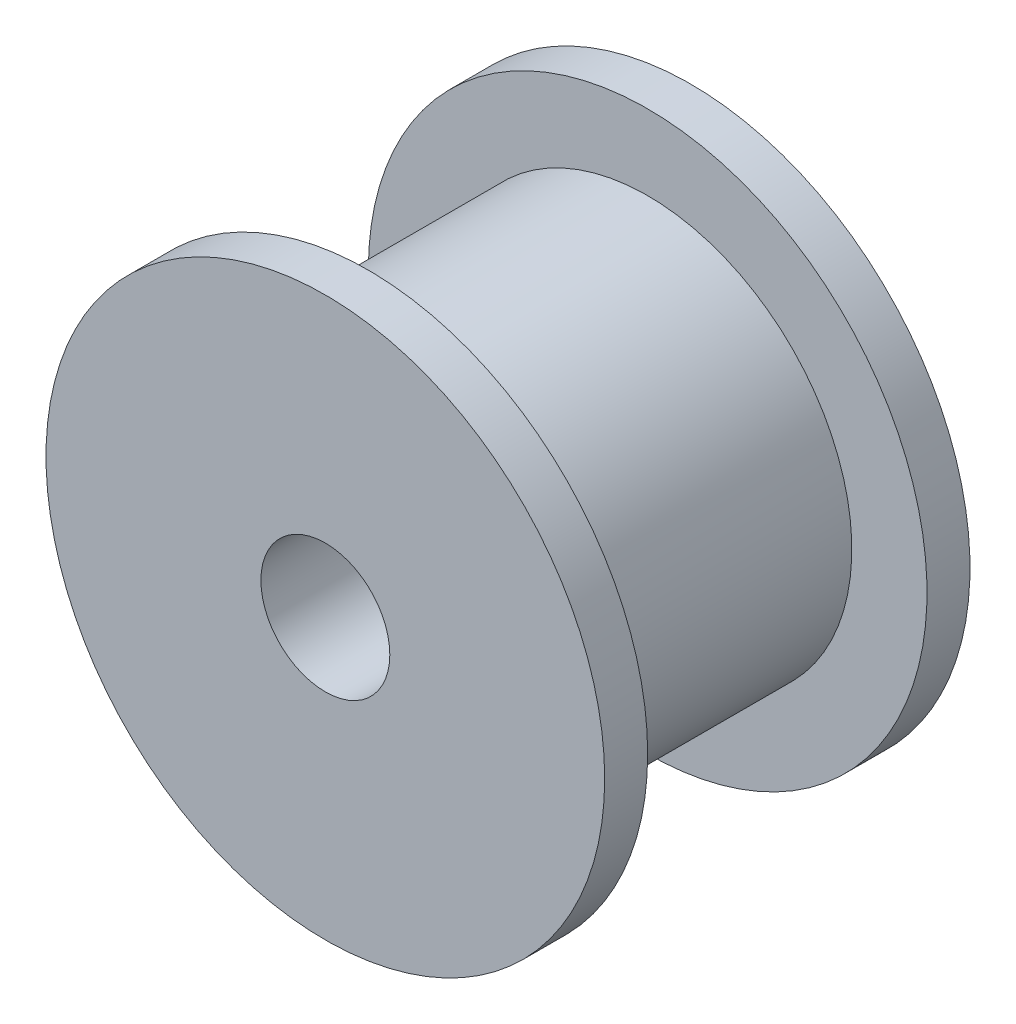
ISO-10303-21;
HEADER;
FILE_DESCRIPTION(('STEP AP214'),'2;1');
FILE_NAME('part.step','',(''),(''),'','','');
FILE_SCHEMA(('AUTOMOTIVE_DESIGN { 1 0 10303 214 1 1 1 1 }'));
ENDSEC;
DATA;
#1=APPLICATION_CONTEXT('core data for automotive mechanical design processes');
#2=APPLICATION_PROTOCOL_DEFINITION('international standard','automotive_design',2000,#1);
#3=PRODUCT_CONTEXT('',#1,'mechanical');
#4=PRODUCT('Part','Part','',(#3));
#5=PRODUCT_RELATED_PRODUCT_CATEGORY('part','',(#4));
#6=PRODUCT_DEFINITION_FORMATION('','',#4);
#7=PRODUCT_DEFINITION_CONTEXT('part definition',#1,'design');
#8=PRODUCT_DEFINITION('design','',#6,#7);
#9=PRODUCT_DEFINITION_SHAPE('','',#8);
#10=(LENGTH_UNIT() NAMED_UNIT(*) SI_UNIT(.MILLI.,.METRE.));
#11=(NAMED_UNIT(*) PLANE_ANGLE_UNIT() SI_UNIT($,.RADIAN.));
#12=(NAMED_UNIT(*) SI_UNIT($,.STERADIAN.) SOLID_ANGLE_UNIT());
#13=UNCERTAINTY_MEASURE_WITH_UNIT(LENGTH_MEASURE(1.E-05),#10,'distance_accuracy_value','');
#14=(GEOMETRIC_REPRESENTATION_CONTEXT(3) GLOBAL_UNCERTAINTY_ASSIGNED_CONTEXT((#13)) GLOBAL_UNIT_ASSIGNED_CONTEXT((#10,
#11,#12)) REPRESENTATION_CONTEXT('',''));
#15=CARTESIAN_POINT('',(0.,0.,0.));
#16=DIRECTION('',(0.,0.,1.));
#17=DIRECTION('',(1.,0.,0.));
#18=AXIS2_PLACEMENT_3D('',#15,#16,#17);
#19=CARTESIAN_POINT('',(0.,0.,8.5));
#20=DIRECTION('',(0.,0.,-1.));
#21=DIRECTION('',(-1.,0.,0.));
#22=AXIS2_PLACEMENT_3D('',#19,#20,#21);
#23=CYLINDRICAL_SURFACE('',#22,4.75);
#24=CARTESIAN_POINT('',(0.,0.,7.5));
#25=DIRECTION('',(0.,0.,1.));
#26=DIRECTION('',(1.,0.,0.));
#27=AXIS2_PLACEMENT_3D('',#24,#25,#26);
#28=CIRCLE('',#27,4.75);
#29=CARTESIAN_POINT('',(4.75,0.,7.5));
#30=VERTEX_POINT('',#29);
#31=EDGE_CURVE('E44',#30,#30,#28,.T.);
#32=ORIENTED_EDGE('',*,*,#31,.F.);
#33=EDGE_LOOP('',(#32));
#34=FACE_BOUND('',#33,.T.);
#35=CARTESIAN_POINT('',(0.,0.,1.));
#36=DIRECTION('',(0.,0.,-1.));
#37=DIRECTION('',(-1.,0.,0.));
#38=AXIS2_PLACEMENT_3D('',#35,#36,#37);
#39=CIRCLE('',#38,4.75);
#40=CARTESIAN_POINT('',(-4.75,0.,1.));
#41=VERTEX_POINT('',#40);
#42=EDGE_CURVE('E10',#41,#41,#39,.T.);
#43=ORIENTED_EDGE('',*,*,#42,.F.);
#44=EDGE_LOOP('',(#43));
#45=FACE_BOUND('',#44,.T.);
#46=ADVANCED_FACE('F37',(#34,#45),#23,.T.);
#47=CARTESIAN_POINT('',(0.,0.,7.5));
#48=DIRECTION('',(0.,0.,1.));
#49=DIRECTION('',(1.,0.,0.));
#50=AXIS2_PLACEMENT_3D('',#47,#48,#49);
#51=CYLINDRICAL_SURFACE('',#50,6.5);
#52=CARTESIAN_POINT('',(0.,0.,7.5));
#53=DIRECTION('',(0.,0.,1.));
#54=DIRECTION('',(1.,0.,0.));
#55=AXIS2_PLACEMENT_3D('',#52,#53,#54);
#56=CIRCLE('',#55,6.5);
#57=CARTESIAN_POINT('',(6.5,0.,7.5));
#58=VERTEX_POINT('',#57);
#59=EDGE_CURVE('E49',#58,#58,#56,.T.);
#60=ORIENTED_EDGE('',*,*,#59,.T.);
#61=EDGE_LOOP('',(#60));
#62=FACE_BOUND('',#61,.T.);
#63=CARTESIAN_POINT('',(0.,0.,8.5));
#64=DIRECTION('',(0.,0.,1.));
#65=DIRECTION('',(1.,0.,0.));
#66=AXIS2_PLACEMENT_3D('',#63,#64,#65);
#67=CIRCLE('',#66,6.5);
#68=CARTESIAN_POINT('',(6.5,0.,8.5));
#69=VERTEX_POINT('',#68);
#70=EDGE_CURVE('E54',#69,#69,#67,.T.);
#71=ORIENTED_EDGE('',*,*,#70,.F.);
#72=EDGE_LOOP('',(#71));
#73=FACE_BOUND('',#72,.T.);
#74=ADVANCED_FACE('F100',(#62,#73),#51,.T.);
#75=CARTESIAN_POINT('',(0.,0.,7.5));
#76=DIRECTION('',(0.,0.,1.));
#77=DIRECTION('',(1.,0.,0.));
#78=AXIS2_PLACEMENT_3D('',#75,#76,#77);
#79=PLANE('',#78);
#80=ORIENTED_EDGE('',*,*,#31,.T.);
#81=EDGE_LOOP('',(#80));
#82=FACE_BOUND('',#81,.T.);
#83=ORIENTED_EDGE('',*,*,#59,.F.);
#84=EDGE_LOOP('',(#83));
#85=FACE_BOUND('',#84,.T.);
#86=ADVANCED_FACE('F95',(#82,#85),#79,.F.);
#87=CARTESIAN_POINT('',(0.,0.,8.5));
#88=DIRECTION('',(0.,0.,1.));
#89=DIRECTION('',(1.,0.,0.));
#90=AXIS2_PLACEMENT_3D('',#87,#88,#89);
#91=PLANE('',#90);
#92=CARTESIAN_POINT('',(0.,0.,8.5));
#93=DIRECTION('',(0.,0.,1.));
#94=DIRECTION('',(1.,0.,0.));
#95=AXIS2_PLACEMENT_3D('',#92,#93,#94);
#96=CIRCLE('',#95,1.5);
#97=CARTESIAN_POINT('',(1.5,0.,8.5));
#98=VERTEX_POINT('',#97);
#99=EDGE_CURVE('E65',#98,#98,#96,.T.);
#100=ORIENTED_EDGE('',*,*,#99,.F.);
#101=EDGE_LOOP('',(#100));
#102=FACE_BOUND('',#101,.T.);
#103=ORIENTED_EDGE('',*,*,#70,.T.);
#104=EDGE_LOOP('',(#103));
#105=FACE_BOUND('',#104,.T.);
#106=ADVANCED_FACE('F87',(#102,#105),#91,.T.);
#107=CARTESIAN_POINT('',(0.,0.,1.));
#108=DIRECTION('',(0.,0.,-1.));
#109=DIRECTION('',(-1.,0.,0.));
#110=AXIS2_PLACEMENT_3D('',#107,#108,#109);
#111=CYLINDRICAL_SURFACE('',#110,6.5);
#112=CARTESIAN_POINT('',(0.,0.,1.));
#113=DIRECTION('',(0.,0.,-1.));
#114=DIRECTION('',(-1.,0.,0.));
#115=AXIS2_PLACEMENT_3D('',#112,#113,#114);
#116=CIRCLE('',#115,6.5);
#117=CARTESIAN_POINT('',(-6.5,0.,1.));
#118=VERTEX_POINT('',#117);
#119=EDGE_CURVE('E59',#118,#118,#116,.T.);
#120=ORIENTED_EDGE('',*,*,#119,.T.);
#121=EDGE_LOOP('',(#120));
#122=FACE_BOUND('',#121,.T.);
#123=CARTESIAN_POINT('',(0.,0.,0.));
#124=DIRECTION('',(0.,0.,-1.));
#125=DIRECTION('',(-1.,0.,0.));
#126=AXIS2_PLACEMENT_3D('',#123,#124,#125);
#127=CIRCLE('',#126,6.5);
#128=CARTESIAN_POINT('',(-6.5,0.,0.));
#129=VERTEX_POINT('',#128);
#130=EDGE_CURVE('E61',#129,#129,#127,.T.);
#131=ORIENTED_EDGE('',*,*,#130,.F.);
#132=EDGE_LOOP('',(#131));
#133=FACE_BOUND('',#132,.T.);
#134=ADVANCED_FACE('F85',(#122,#133),#111,.T.);
#135=CARTESIAN_POINT('',(0.,0.,1.));
#136=DIRECTION('',(0.,0.,-1.));
#137=DIRECTION('',(-1.,0.,0.));
#138=AXIS2_PLACEMENT_3D('',#135,#136,#137);
#139=PLANE('',#138);
#140=ORIENTED_EDGE('',*,*,#42,.T.);
#141=EDGE_LOOP('',(#140));
#142=FACE_BOUND('',#141,.T.);
#143=ORIENTED_EDGE('',*,*,#119,.F.);
#144=EDGE_LOOP('',(#143));
#145=FACE_BOUND('',#144,.T.);
#146=ADVANCED_FACE('F82',(#142,#145),#139,.F.);
#147=CARTESIAN_POINT('',(0.,0.,0.));
#148=DIRECTION('',(0.,0.,1.));
#149=DIRECTION('',(1.,0.,0.));
#150=AXIS2_PLACEMENT_3D('',#147,#148,#149);
#151=PLANE('',#150);
#152=CARTESIAN_POINT('',(0.,0.,0.));
#153=DIRECTION('',(0.,0.,-1.));
#154=DIRECTION('',(-1.,0.,0.));
#155=AXIS2_PLACEMENT_3D('',#152,#153,#154);
#156=CIRCLE('',#155,1.5);
#157=CARTESIAN_POINT('',(-1.5,0.,0.));
#158=VERTEX_POINT('',#157);
#159=EDGE_CURVE('E72',#158,#158,#156,.T.);
#160=ORIENTED_EDGE('',*,*,#159,.F.);
#161=EDGE_LOOP('',(#160));
#162=FACE_BOUND('',#161,.T.);
#163=ORIENTED_EDGE('',*,*,#130,.T.);
#164=EDGE_LOOP('',(#163));
#165=FACE_BOUND('',#164,.T.);
#166=ADVANCED_FACE('F79',(#162,#165),#151,.F.);
#167=CARTESIAN_POINT('',(0.,0.,12.));
#168=DIRECTION('',(0.,0.,-1.));
#169=DIRECTION('',(-1.,0.,0.));
#170=AXIS2_PLACEMENT_3D('',#167,#168,#169);
#171=CYLINDRICAL_SURFACE('',#170,1.5);
#172=ORIENTED_EDGE('',*,*,#99,.T.);
#173=EDGE_LOOP('',(#172));
#174=FACE_BOUND('',#173,.T.);
#175=ORIENTED_EDGE('',*,*,#159,.T.);
#176=EDGE_LOOP('',(#175));
#177=FACE_BOUND('',#176,.T.);
#178=ADVANCED_FACE('F77',(#174,#177),#171,.F.);
#179=CLOSED_SHELL('',(#46,#74,#86,#106,#134,#146,#166,#178));
#180=MANIFOLD_SOLID_BREP('B2',#179);
#181=ADVANCED_BREP_SHAPE_REPRESENTATION('',(#18,#180),#14);
#182=SHAPE_DEFINITION_REPRESENTATION(#9,#181);
ENDSEC;
END-ISO-10303-21;
